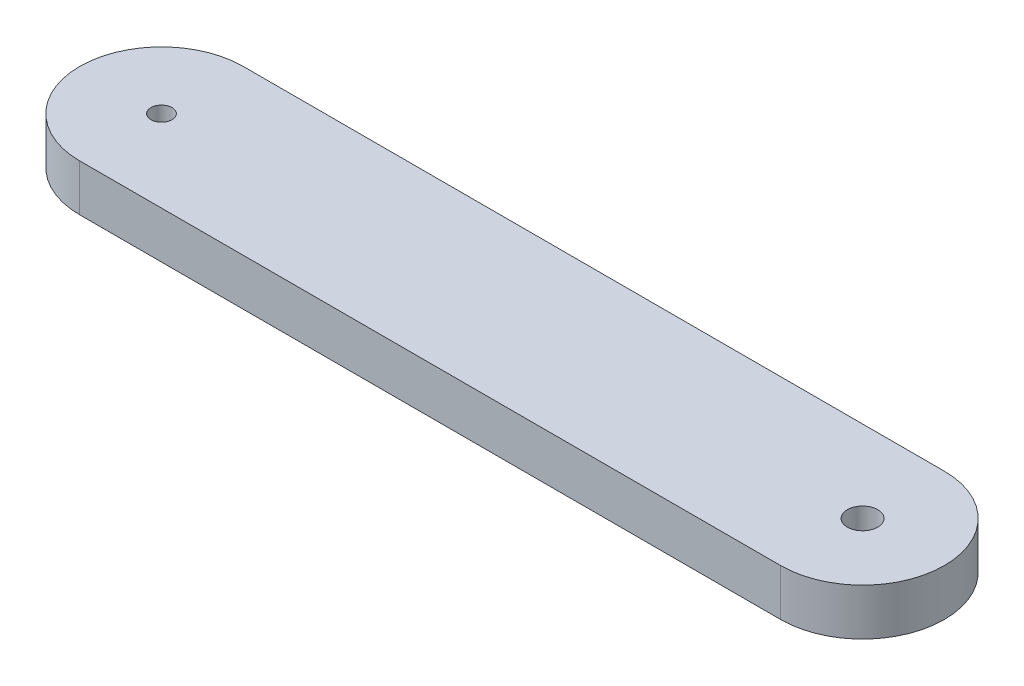
ISO-10303-21;
HEADER;
FILE_DESCRIPTION(('STEP AP214'),'2;1');
FILE_NAME('part.step','',(''),(''),'','','');
FILE_SCHEMA(('AUTOMOTIVE_DESIGN { 1 0 10303 214 1 1 1 1 }'));
ENDSEC;
DATA;
#1=APPLICATION_CONTEXT('core data for automotive mechanical design processes');
#2=APPLICATION_PROTOCOL_DEFINITION('international standard','automotive_design',2000,#1);
#3=PRODUCT_CONTEXT('',#1,'mechanical');
#4=PRODUCT('Part','Part','',(#3));
#5=PRODUCT_RELATED_PRODUCT_CATEGORY('part','',(#4));
#6=PRODUCT_DEFINITION_FORMATION('','',#4);
#7=PRODUCT_DEFINITION_CONTEXT('part definition',#1,'design');
#8=PRODUCT_DEFINITION('design','',#6,#7);
#9=PRODUCT_DEFINITION_SHAPE('','',#8);
#10=(LENGTH_UNIT() NAMED_UNIT(*) SI_UNIT(.MILLI.,.METRE.));
#11=(NAMED_UNIT(*) PLANE_ANGLE_UNIT() SI_UNIT($,.RADIAN.));
#12=(NAMED_UNIT(*) SI_UNIT($,.STERADIAN.) SOLID_ANGLE_UNIT());
#13=UNCERTAINTY_MEASURE_WITH_UNIT(LENGTH_MEASURE(1.E-05),#10,'distance_accuracy_value','');
#14=(GEOMETRIC_REPRESENTATION_CONTEXT(3) GLOBAL_UNCERTAINTY_ASSIGNED_CONTEXT((#13)) GLOBAL_UNIT_ASSIGNED_CONTEXT((#10,
#11,#12)) REPRESENTATION_CONTEXT('',''));
#15=CARTESIAN_POINT('',(0.,0.,0.));
#16=DIRECTION('',(0.,0.,1.));
#17=DIRECTION('',(1.,0.,0.));
#18=AXIS2_PLACEMENT_3D('',#15,#16,#17);
#19=CARTESIAN_POINT('',(0.,10.,0.));
#20=DIRECTION('',(0.,1.,0.));
#21=DIRECTION('',(0.,0.,1.));
#22=AXIS2_PLACEMENT_3D('',#19,#20,#21);
#23=PLANE('',#22);
#24=CARTESIAN_POINT('',(0.,10.,0.));
#25=DIRECTION('',(0.,1.,0.));
#26=DIRECTION('',(0.,0.,1.));
#27=AXIS2_PLACEMENT_3D('',#24,#25,#26);
#28=CIRCLE('',#27,2.25);
#29=CARTESIAN_POINT('',(0.,10.,2.25));
#30=VERTEX_POINT('',#29);
#31=EDGE_CURVE('E103',#30,#30,#28,.T.);
#32=ORIENTED_EDGE('',*,*,#31,.F.);
#33=EDGE_LOOP('',(#32));
#34=FACE_BOUND('',#33,.T.);
#35=CARTESIAN_POINT('',(0.,10.,0.));
#36=DIRECTION('',(0.,1.,0.));
#37=DIRECTION('',(0.,0.,1.));
#38=AXIS2_PLACEMENT_3D('',#35,#36,#37);
#39=CIRCLE('',#38,17.5);
#40=CARTESIAN_POINT('',(0.,10.,-17.5));
#41=VERTEX_POINT('',#40);
#42=CARTESIAN_POINT('',(0.,10.,17.5));
#43=VERTEX_POINT('',#42);
#44=EDGE_CURVE('E88',#41,#43,#39,.T.);
#45=ORIENTED_EDGE('',*,*,#44,.T.);
#46=DIRECTION('',(1.,0.,0.));
#47=VECTOR('',#46,1.);
#48=CARTESIAN_POINT('',(0.,10.,17.5));
#49=LINE('',#48,#47);
#50=CARTESIAN_POINT('',(150.,10.,17.5));
#51=VERTEX_POINT('',#50);
#52=EDGE_CURVE('E83',#43,#51,#49,.T.);
#53=ORIENTED_EDGE('',*,*,#52,.T.);
#54=CARTESIAN_POINT('',(150.,10.,0.));
#55=DIRECTION('',(0.,1.,0.));
#56=DIRECTION('',(0.,0.,1.));
#57=AXIS2_PLACEMENT_3D('',#54,#55,#56);
#58=CIRCLE('',#57,17.5);
#59=CARTESIAN_POINT('',(150.,10.,-17.5));
#60=VERTEX_POINT('',#59);
#61=EDGE_CURVE('E86',#51,#60,#58,.T.);
#62=ORIENTED_EDGE('',*,*,#61,.T.);
#63=DIRECTION('',(-1.,0.,0.));
#64=VECTOR('',#63,1.);
#65=CARTESIAN_POINT('',(0.,10.,-17.5));
#66=LINE('',#65,#64);
#67=EDGE_CURVE('E53',#60,#41,#66,.T.);
#68=ORIENTED_EDGE('',*,*,#67,.T.);
#69=EDGE_LOOP('',(#45,#53,#62,#68));
#70=FACE_BOUND('',#69,.T.);
#71=CARTESIAN_POINT('',(150.,10.,0.));
#72=DIRECTION('',(0.,1.,0.));
#73=DIRECTION('',(0.,0.,1.));
#74=AXIS2_PLACEMENT_3D('',#71,#72,#73);
#75=CIRCLE('',#74,3.25000000000001);
#76=CARTESIAN_POINT('',(150.,10.,3.25000000000001));
#77=VERTEX_POINT('',#76);
#78=EDGE_CURVE('E118',#77,#77,#75,.T.);
#79=ORIENTED_EDGE('',*,*,#78,.F.);
#80=EDGE_LOOP('',(#79));
#81=FACE_BOUND('',#80,.T.);
#82=ADVANCED_FACE('F36',(#34,#70,#81),#23,.T.);
#83=CARTESIAN_POINT('',(0.,0.,0.));
#84=DIRECTION('',(0.,1.,0.));
#85=DIRECTION('',(0.,0.,1.));
#86=AXIS2_PLACEMENT_3D('',#83,#84,#85);
#87=PLANE('',#86);
#88=CARTESIAN_POINT('',(0.,0.,0.));
#89=DIRECTION('',(0.,1.,0.));
#90=DIRECTION('',(0.,0.,1.));
#91=AXIS2_PLACEMENT_3D('',#88,#89,#90);
#92=CIRCLE('',#91,17.5);
#93=CARTESIAN_POINT('',(0.,0.,-17.5));
#94=VERTEX_POINT('',#93);
#95=CARTESIAN_POINT('',(0.,0.,17.5));
#96=VERTEX_POINT('',#95);
#97=EDGE_CURVE('E100',#94,#96,#92,.T.);
#98=ORIENTED_EDGE('',*,*,#97,.F.);
#99=DIRECTION('',(-1.,0.,0.));
#100=VECTOR('',#99,1.);
#101=CARTESIAN_POINT('',(0.,0.,-17.5));
#102=LINE('',#101,#100);
#103=CARTESIAN_POINT('',(150.,0.,-17.5));
#104=VERTEX_POINT('',#103);
#105=EDGE_CURVE('E76',#104,#94,#102,.T.);
#106=ORIENTED_EDGE('',*,*,#105,.F.);
#107=CARTESIAN_POINT('',(150.,0.,0.));
#108=DIRECTION('',(0.,1.,0.));
#109=DIRECTION('',(0.,0.,1.));
#110=AXIS2_PLACEMENT_3D('',#107,#108,#109);
#111=CIRCLE('',#110,17.5);
#112=CARTESIAN_POINT('',(150.,0.,17.5));
#113=VERTEX_POINT('',#112);
#114=EDGE_CURVE('E70',#113,#104,#111,.T.);
#115=ORIENTED_EDGE('',*,*,#114,.F.);
#116=DIRECTION('',(1.,0.,0.));
#117=VECTOR('',#116,1.);
#118=CARTESIAN_POINT('',(0.,0.,17.5));
#119=LINE('',#118,#117);
#120=EDGE_CURVE('E92',#96,#113,#119,.T.);
#121=ORIENTED_EDGE('',*,*,#120,.F.);
#122=EDGE_LOOP('',(#98,#106,#115,#121));
#123=FACE_BOUND('',#122,.T.);
#124=CARTESIAN_POINT('',(0.,0.,0.));
#125=DIRECTION('',(0.,1.,0.));
#126=DIRECTION('',(0.,0.,1.));
#127=AXIS2_PLACEMENT_3D('',#124,#125,#126);
#128=CIRCLE('',#127,2.25);
#129=CARTESIAN_POINT('',(0.,0.,2.25));
#130=VERTEX_POINT('',#129);
#131=EDGE_CURVE('E115',#130,#130,#128,.T.);
#132=ORIENTED_EDGE('',*,*,#131,.T.);
#133=EDGE_LOOP('',(#132));
#134=FACE_BOUND('',#133,.T.);
#135=CARTESIAN_POINT('',(150.,0.,0.));
#136=DIRECTION('',(0.,1.,0.));
#137=DIRECTION('',(0.,0.,1.));
#138=AXIS2_PLACEMENT_3D('',#135,#136,#137);
#139=CIRCLE('',#138,3.25000000000001);
#140=CARTESIAN_POINT('',(150.,0.,3.25000000000001));
#141=VERTEX_POINT('',#140);
#142=EDGE_CURVE('E121',#141,#141,#139,.T.);
#143=ORIENTED_EDGE('',*,*,#142,.T.);
#144=EDGE_LOOP('',(#143));
#145=FACE_BOUND('',#144,.T.);
#146=ADVANCED_FACE('F111',(#123,#134,#145),#87,.F.);
#147=CARTESIAN_POINT('',(0.,10.,0.));
#148=DIRECTION('',(0.,-1.,0.));
#149=DIRECTION('',(0.,0.,-1.));
#150=AXIS2_PLACEMENT_3D('',#147,#148,#149);
#151=CYLINDRICAL_SURFACE('',#150,17.5);
#152=ORIENTED_EDGE('',*,*,#97,.T.);
#153=DIRECTION('',(0.,-1.,0.));
#154=VECTOR('',#153,1.);
#155=CARTESIAN_POINT('',(0.,10.,17.5));
#156=LINE('',#155,#154);
#157=EDGE_CURVE('E11',#43,#96,#156,.T.);
#158=ORIENTED_EDGE('',*,*,#157,.F.);
#159=ORIENTED_EDGE('',*,*,#44,.F.);
#160=DIRECTION('',(0.,-1.,0.));
#161=VECTOR('',#160,1.);
#162=CARTESIAN_POINT('',(0.,10.,-17.5));
#163=LINE('',#162,#161);
#164=EDGE_CURVE('E96',#41,#94,#163,.T.);
#165=ORIENTED_EDGE('',*,*,#164,.T.);
#166=EDGE_LOOP('',(#152,#158,#159,#165));
#167=FACE_BOUND('',#166,.T.);
#168=ADVANCED_FACE('F38',(#167),#151,.T.);
#169=CARTESIAN_POINT('',(0.,10.,17.5));
#170=DIRECTION('',(0.,0.,-1.));
#171=DIRECTION('',(-1.,0.,0.));
#172=AXIS2_PLACEMENT_3D('',#169,#170,#171);
#173=PLANE('',#172);
#174=ORIENTED_EDGE('',*,*,#120,.T.);
#175=DIRECTION('',(0.,-1.,0.));
#176=VECTOR('',#175,1.);
#177=CARTESIAN_POINT('',(150.,10.,17.5));
#178=LINE('',#177,#176);
#179=EDGE_CURVE('E45',#51,#113,#178,.T.);
#180=ORIENTED_EDGE('',*,*,#179,.F.);
#181=ORIENTED_EDGE('',*,*,#52,.F.);
#182=ORIENTED_EDGE('',*,*,#157,.T.);
#183=EDGE_LOOP('',(#174,#180,#181,#182));
#184=FACE_BOUND('',#183,.T.);
#185=ADVANCED_FACE('F91',(#184),#173,.F.);
#186=CARTESIAN_POINT('',(150.,10.,0.));
#187=DIRECTION('',(0.,-1.,0.));
#188=DIRECTION('',(0.,0.,-1.));
#189=AXIS2_PLACEMENT_3D('',#186,#187,#188);
#190=CYLINDRICAL_SURFACE('',#189,17.5);
#191=ORIENTED_EDGE('',*,*,#114,.T.);
#192=DIRECTION('',(0.,-1.,0.));
#193=VECTOR('',#192,1.);
#194=CARTESIAN_POINT('',(150.,10.,-17.5));
#195=LINE('',#194,#193);
#196=EDGE_CURVE('E93',#60,#104,#195,.T.);
#197=ORIENTED_EDGE('',*,*,#196,.F.);
#198=ORIENTED_EDGE('',*,*,#61,.F.);
#199=ORIENTED_EDGE('',*,*,#179,.T.);
#200=EDGE_LOOP('',(#191,#197,#198,#199));
#201=FACE_BOUND('',#200,.T.);
#202=ADVANCED_FACE('F94',(#201),#190,.T.);
#203=CARTESIAN_POINT('',(0.,10.,-17.5));
#204=DIRECTION('',(0.,0.,1.));
#205=DIRECTION('',(1.,0.,0.));
#206=AXIS2_PLACEMENT_3D('',#203,#204,#205);
#207=PLANE('',#206);
#208=ORIENTED_EDGE('',*,*,#105,.T.);
#209=ORIENTED_EDGE('',*,*,#164,.F.);
#210=ORIENTED_EDGE('',*,*,#67,.F.);
#211=ORIENTED_EDGE('',*,*,#196,.T.);
#212=EDGE_LOOP('',(#208,#209,#210,#211));
#213=FACE_BOUND('',#212,.T.);
#214=ADVANCED_FACE('F108',(#213),#207,.F.);
#215=CARTESIAN_POINT('',(0.,10.,0.));
#216=DIRECTION('',(0.,-1.,0.));
#217=DIRECTION('',(0.,0.,-1.));
#218=AXIS2_PLACEMENT_3D('',#215,#216,#217);
#219=CYLINDRICAL_SURFACE('',#218,2.25);
#220=ORIENTED_EDGE('',*,*,#31,.T.);
#221=EDGE_LOOP('',(#220));
#222=FACE_BOUND('',#221,.T.);
#223=ORIENTED_EDGE('',*,*,#131,.F.);
#224=EDGE_LOOP('',(#223));
#225=FACE_BOUND('',#224,.T.);
#226=ADVANCED_FACE('F138',(#222,#225),#219,.F.);
#227=CARTESIAN_POINT('',(150.,10.,0.));
#228=DIRECTION('',(0.,-1.,0.));
#229=DIRECTION('',(0.,0.,-1.));
#230=AXIS2_PLACEMENT_3D('',#227,#228,#229);
#231=CYLINDRICAL_SURFACE('',#230,3.25000000000001);
#232=ORIENTED_EDGE('',*,*,#78,.T.);
#233=EDGE_LOOP('',(#232));
#234=FACE_BOUND('',#233,.T.);
#235=ORIENTED_EDGE('',*,*,#142,.F.);
#236=EDGE_LOOP('',(#235));
#237=FACE_BOUND('',#236,.T.);
#238=ADVANCED_FACE('F127',(#234,#237),#231,.F.);
#239=CLOSED_SHELL('',(#82,#146,#168,#185,#202,#214,#226,#238));
#240=MANIFOLD_SOLID_BREP('B2',#239);
#241=ADVANCED_BREP_SHAPE_REPRESENTATION('',(#18,#240),#14);
#242=SHAPE_DEFINITION_REPRESENTATION(#9,#241);
ENDSEC;
END-ISO-10303-21;
